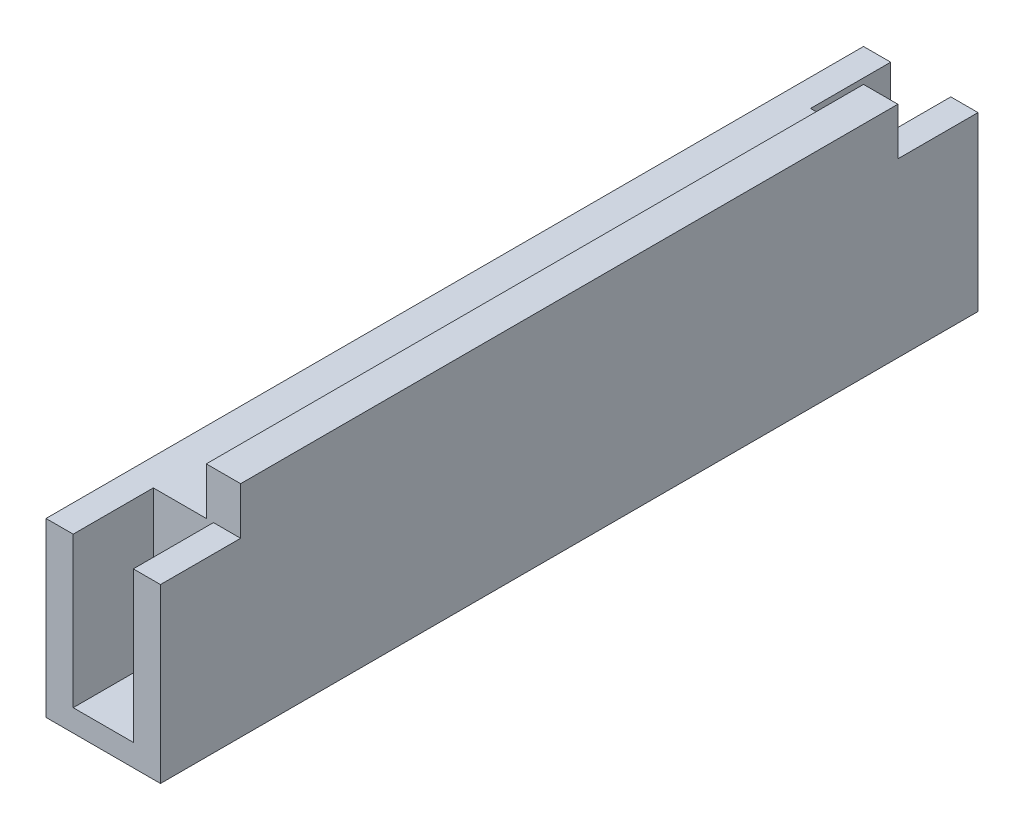
ISO-10303-21;
HEADER;
FILE_DESCRIPTION(('STEP AP214'),'2;1');
FILE_NAME('part.step','',(''),(''),'','','');
FILE_SCHEMA(('AUTOMOTIVE_DESIGN { 1 0 10303 214 1 1 1 1 }'));
ENDSEC;
DATA;
#1=APPLICATION_CONTEXT('core data for automotive mechanical design processes');
#2=APPLICATION_PROTOCOL_DEFINITION('international standard','automotive_design',2000,#1);
#3=PRODUCT_CONTEXT('',#1,'mechanical');
#4=PRODUCT('Part','Part','',(#3));
#5=PRODUCT_RELATED_PRODUCT_CATEGORY('part','',(#4));
#6=PRODUCT_DEFINITION_FORMATION('','',#4);
#7=PRODUCT_DEFINITION_CONTEXT('part definition',#1,'design');
#8=PRODUCT_DEFINITION('design','',#6,#7);
#9=PRODUCT_DEFINITION_SHAPE('','',#8);
#10=(LENGTH_UNIT() NAMED_UNIT(*) SI_UNIT(.MILLI.,.METRE.));
#11=(NAMED_UNIT(*) PLANE_ANGLE_UNIT() SI_UNIT($,.RADIAN.));
#12=(NAMED_UNIT(*) SI_UNIT($,.STERADIAN.) SOLID_ANGLE_UNIT());
#13=UNCERTAINTY_MEASURE_WITH_UNIT(LENGTH_MEASURE(1.E-05),#10,'distance_accuracy_value','');
#14=(GEOMETRIC_REPRESENTATION_CONTEXT(3) GLOBAL_UNCERTAINTY_ASSIGNED_CONTEXT((#13)) GLOBAL_UNIT_ASSIGNED_CONTEXT((#10,
#11,#12)) REPRESENTATION_CONTEXT('',''));
#15=CARTESIAN_POINT('',(0.,0.,0.));
#16=DIRECTION('',(0.,0.,1.));
#17=DIRECTION('',(1.,0.,0.));
#18=AXIS2_PLACEMENT_3D('',#15,#16,#17);
#19=CARTESIAN_POINT('',(-41.8906827095096,0.133383078751972,10.2));
#20=CARTESIAN_POINT('',(-41.8906827095096,4.95,10.2));
#21=CARTESIAN_POINT('',(-37.2024901953828,0.133383078751972,10.2));
#22=CARTESIAN_POINT('',(-37.2024901953828,4.95,10.2));
#23=(BOUNDED_SURFACE() B_SPLINE_SURFACE(1,1,((#19,#20),(#21,#22)),.UNSPECIFIED.,.F.,.F.,
.F.) B_SPLINE_SURFACE_WITH_KNOTS((2,2),(2,2),(0.,1.),(2.04421535087847,6.8608322721265),
.UNSPECIFIED.) GEOMETRIC_REPRESENTATION_ITEM() RATIONAL_B_SPLINE_SURFACE(((1.,1.),(1.,1.))) REPRESENTATION_ITEM('') SURFACE());
#24=CARTESIAN_POINT('',(-38.2715864524463,4.95,10.2));
#25=CARTESIAN_POINT('',(-38.2715864524463,1.2,10.2));
#26=(BOUNDED_CURVE() B_SPLINE_CURVE(1,(#24,#25),.UNSPECIFIED.,.F.,
.F.) B_SPLINE_CURVE_WITH_KNOTS((2,2),(0.,1.),
.UNSPECIFIED.) CURVE() GEOMETRIC_REPRESENTATION_ITEM() RATIONAL_B_SPLINE_CURVE((1.,1.)) REPRESENTATION_ITEM(''));
#27=CARTESIAN_POINT('',(-38.2715864524463,4.95,10.2));
#28=VERTEX_POINT('',#27);
#29=CARTESIAN_POINT('',(-38.2715864524463,1.2,10.2));
#30=VERTEX_POINT('',#29);
#31=EDGE_CURVE('E11',#28,#30,#26,.T.);
#32=CARTESIAN_POINT('',(-38.2715864524463,1.2,10.2));
#33=CARTESIAN_POINT('',(-39.7715864524463,1.2,10.2));
#34=(BOUNDED_CURVE() B_SPLINE_CURVE(1,(#32,#33),.UNSPECIFIED.,.F.,
.F.) B_SPLINE_CURVE_WITH_KNOTS((2,2),(0.,1.),
.UNSPECIFIED.) CURVE() GEOMETRIC_REPRESENTATION_ITEM() RATIONAL_B_SPLINE_CURVE((1.,1.)) REPRESENTATION_ITEM(''));
#35=CARTESIAN_POINT('',(-39.7715864524463,1.2,10.2));
#36=VERTEX_POINT('',#35);
#37=EDGE_CURVE('E32',#30,#36,#34,.T.);
#38=CARTESIAN_POINT('',(-39.7715864524463,1.2,10.2));
#39=CARTESIAN_POINT('',(-39.7715864524463,4.95,10.2));
#40=(BOUNDED_CURVE() B_SPLINE_CURVE(1,(#38,#39),.UNSPECIFIED.,.F.,
.F.) B_SPLINE_CURVE_WITH_KNOTS((2,2),(0.,1.),
.UNSPECIFIED.) CURVE() GEOMETRIC_REPRESENTATION_ITEM() RATIONAL_B_SPLINE_CURVE((1.,1.)) REPRESENTATION_ITEM(''));
#41=CARTESIAN_POINT('',(-39.7715864524463,4.95,10.2));
#42=VERTEX_POINT('',#41);
#43=EDGE_CURVE('E410',#36,#42,#40,.T.);
#44=CARTESIAN_POINT('',(-40.4499999999991,4.95,10.2));
#45=CARTESIAN_POINT('',(-39.7715864524463,4.95,10.2));
#46=(BOUNDED_CURVE() B_SPLINE_CURVE(1,(#44,#45),.UNSPECIFIED.,.F.,
.F.) B_SPLINE_CURVE_WITH_KNOTS((2,2),(0.307300245279898,0.452007090297156),
.UNSPECIFIED.) CURVE() GEOMETRIC_REPRESENTATION_ITEM() RATIONAL_B_SPLINE_CURVE((1.,1.)) REPRESENTATION_ITEM(''));
#47=CARTESIAN_POINT('',(-40.4499999999991,4.95,10.2));
#48=VERTEX_POINT('',#47);
#49=EDGE_CURVE('E155',#48,#42,#46,.T.);
#50=CARTESIAN_POINT('',(-40.4499999999991,0.650000000000009,10.2));
#51=CARTESIAN_POINT('',(-40.4499999999991,4.95,10.2));
#52=(BOUNDED_CURVE() B_SPLINE_CURVE(1,(#50,#51),.UNSPECIFIED.,.F.,
.F.) B_SPLINE_CURVE_WITH_KNOTS((2,2),(0.107257215945289,1.),
.UNSPECIFIED.) CURVE() GEOMETRIC_REPRESENTATION_ITEM() RATIONAL_B_SPLINE_CURVE((1.,1.)) REPRESENTATION_ITEM(''));
#53=CARTESIAN_POINT('',(-40.4499999999991,0.65,10.2));
#54=VERTEX_POINT('',#53);
#55=EDGE_CURVE('E408',#54,#48,#52,.T.);
#56=CARTESIAN_POINT('',(-40.4499999999991,0.650000000000009,10.2));
#57=CARTESIAN_POINT('',(-37.5931729048935,0.650000000000009,10.2));
#58=(BOUNDED_CURVE() B_SPLINE_CURVE(1,(#56,#57),.UNSPECIFIED.,.F.,
.F.) B_SPLINE_CURVE_WITH_KNOTS((2,2),(0.307300245279903,0.91666666666665),
.UNSPECIFIED.) CURVE() GEOMETRIC_REPRESENTATION_ITEM() RATIONAL_B_SPLINE_CURVE((1.,1.)) REPRESENTATION_ITEM(''));
#59=CARTESIAN_POINT('',(-37.5931729048935,0.65,10.2));
#60=VERTEX_POINT('',#59);
#61=EDGE_CURVE('E191',#54,#60,#58,.T.);
#62=CARTESIAN_POINT('',(-37.5931729048935,4.95,10.2));
#63=CARTESIAN_POINT('',(-37.5931729048935,0.650000000000009,10.2));
#64=(BOUNDED_CURVE() B_SPLINE_CURVE(1,(#62,#63),.UNSPECIFIED.,.F.,
.F.) B_SPLINE_CURVE_WITH_KNOTS((2,2),(0.,0.892742784054711),
.UNSPECIFIED.) CURVE() GEOMETRIC_REPRESENTATION_ITEM() RATIONAL_B_SPLINE_CURVE((1.,1.)) REPRESENTATION_ITEM(''));
#65=CARTESIAN_POINT('',(-37.5931729048935,4.95,10.2));
#66=VERTEX_POINT('',#65);
#67=EDGE_CURVE('E304',#66,#60,#64,.T.);
#68=CARTESIAN_POINT('',(-38.2715864524463,4.95,10.2));
#69=CARTESIAN_POINT('',(-37.5931729048935,4.95,10.2));
#70=(BOUNDED_CURVE() B_SPLINE_CURVE(1,(#68,#69),.UNSPECIFIED.,.F.,
.F.) B_SPLINE_CURVE_WITH_KNOTS((2,2),(0.771959821649399,0.916666666666644),
.UNSPECIFIED.) CURVE() GEOMETRIC_REPRESENTATION_ITEM() RATIONAL_B_SPLINE_CURVE((1.,1.)) REPRESENTATION_ITEM(''));
#71=EDGE_CURVE('E274',#28,#66,#70,.T.);
#72=ORIENTED_EDGE('',*,*,#31,.T.);
#73=ORIENTED_EDGE('',*,*,#37,.T.);
#74=ORIENTED_EDGE('',*,*,#43,.T.);
#75=ORIENTED_EDGE('',*,*,#49,.F.);
#76=ORIENTED_EDGE('',*,*,#55,.F.);
#77=ORIENTED_EDGE('',*,*,#61,.T.);
#78=ORIENTED_EDGE('',*,*,#67,.F.);
#79=ORIENTED_EDGE('',*,*,#71,.F.);
#80=EDGE_LOOP('',(#72,#73,#74,#75,#76,#77,#78,#79));
#81=FACE_BOUND('',#80,.T.);
#82=ADVANCED_FACE('F17',(#81),#23,.T.);
#83=CARTESIAN_POINT('',(-38.2715864524463,1.2,-12.24));
#84=CARTESIAN_POINT('',(-38.2715864524463,4.95,-12.24));
#85=CARTESIAN_POINT('',(-38.2715864524463,1.2,12.24));
#86=CARTESIAN_POINT('',(-38.2715864524463,4.95,12.24));
#87=(BOUNDED_SURFACE() B_SPLINE_SURFACE(1,1,((#83,#84),(#85,#86)),.UNSPECIFIED.,.F.,.F.,
.F.) B_SPLINE_SURFACE_WITH_KNOTS((2,2),(2,2),(0.,1.),(1.5,9.),
.UNSPECIFIED.) GEOMETRIC_REPRESENTATION_ITEM() RATIONAL_B_SPLINE_SURFACE(((1.,1.),(1.,1.))) REPRESENTATION_ITEM('') SURFACE());
#88=CARTESIAN_POINT('',(-38.2715864524463,4.95,8.2));
#89=CARTESIAN_POINT('',(-38.2715864524463,4.95,10.2));
#90=(BOUNDED_CURVE() B_SPLINE_CURVE(1,(#88,#89),.UNSPECIFIED.,.F.,
.F.) B_SPLINE_CURVE_WITH_KNOTS((2,2),(0.834967320261438,0.916666666666667),
.UNSPECIFIED.) CURVE() GEOMETRIC_REPRESENTATION_ITEM() RATIONAL_B_SPLINE_CURVE((1.,1.)) REPRESENTATION_ITEM(''));
#91=CARTESIAN_POINT('',(-38.2715864524463,4.95,8.2));
#92=VERTEX_POINT('',#91);
#93=EDGE_CURVE('E275',#92,#28,#90,.T.);
#94=CARTESIAN_POINT('',(-38.2715864524463,4.95,8.2));
#95=CARTESIAN_POINT('',(-38.2715864524463,1.2,8.2));
#96=(BOUNDED_CURVE() B_SPLINE_CURVE(1,(#94,#95),.UNSPECIFIED.,.F.,
.F.) B_SPLINE_CURVE_WITH_KNOTS((2,2),(0.,1.),
.UNSPECIFIED.) CURVE() GEOMETRIC_REPRESENTATION_ITEM() RATIONAL_B_SPLINE_CURVE((1.,1.)) REPRESENTATION_ITEM(''));
#97=CARTESIAN_POINT('',(-38.2715864524463,1.2,8.2));
#98=VERTEX_POINT('',#97);
#99=EDGE_CURVE('E182',#92,#98,#96,.T.);
#100=CARTESIAN_POINT('',(-38.2715864524463,1.2,8.2));
#101=CARTESIAN_POINT('',(-38.2715864524463,1.2,10.2));
#102=(BOUNDED_CURVE() B_SPLINE_CURVE(1,(#100,#101),.UNSPECIFIED.,.F.,
.F.) B_SPLINE_CURVE_WITH_KNOTS((2,2),(0.834967320261438,0.916666666666666),
.UNSPECIFIED.) CURVE() GEOMETRIC_REPRESENTATION_ITEM() RATIONAL_B_SPLINE_CURVE((1.,1.)) REPRESENTATION_ITEM(''));
#103=EDGE_CURVE('E23',#98,#30,#102,.T.);
#104=ORIENTED_EDGE('',*,*,#93,.F.);
#105=ORIENTED_EDGE('',*,*,#99,.T.);
#106=ORIENTED_EDGE('',*,*,#103,.T.);
#107=ORIENTED_EDGE('',*,*,#31,.F.);
#108=EDGE_LOOP('',(#104,#105,#106,#107));
#109=FACE_BOUND('',#108,.T.);
#110=ADVANCED_FACE('F337',(#109),#87,.T.);
#111=CARTESIAN_POINT('',(-39.9405579560875,1.10328917316983,8.2));
#112=CARTESIAN_POINT('',(-39.9405579560875,6.248,8.2));
#113=CARTESIAN_POINT('',(-36.4915728521906,1.10328917316983,8.2));
#114=CARTESIAN_POINT('',(-36.4915728521906,6.248,8.2));
#115=(BOUNDED_SURFACE() B_SPLINE_SURFACE(1,1,((#111,#112),(#113,#114)),.UNSPECIFIED.,.F.,.F.,
.F.) B_SPLINE_SURFACE_WITH_KNOTS((2,2),(2,2),(-1.49055795608844,1.95842714780846),
(-2.63327035793089,1.),
.UNSPECIFIED.) GEOMETRIC_REPRESENTATION_ITEM() RATIONAL_B_SPLINE_SURFACE(((1.,1.),(1.,1.))) REPRESENTATION_ITEM('') SURFACE());
#116=CARTESIAN_POINT('',(-38.2715864524463,4.95,8.2));
#117=CARTESIAN_POINT('',(-37.5931729048935,4.95,8.2));
#118=(BOUNDED_CURVE() B_SPLINE_CURVE(1,(#116,#117),.UNSPECIFIED.,.F.,
.F.) B_SPLINE_CURVE_WITH_KNOTS((2,2),(0.208225846932172,1.),
.UNSPECIFIED.) CURVE() GEOMETRIC_REPRESENTATION_ITEM() RATIONAL_B_SPLINE_CURVE((1.,1.)) REPRESENTATION_ITEM(''));
#119=CARTESIAN_POINT('',(-37.5931729048935,4.95,8.2));
#120=VERTEX_POINT('',#119);
#121=EDGE_CURVE('E220',#92,#120,#118,.T.);
#122=CARTESIAN_POINT('',(-37.5931729048935,4.95,8.2));
#123=CARTESIAN_POINT('',(-37.5931729048935,6.13,8.2));
#124=(BOUNDED_CURVE() B_SPLINE_CURVE(1,(#122,#123),.UNSPECIFIED.,.F.,
.F.) B_SPLINE_CURVE_WITH_KNOTS((2,2),(0.0833333333333368,0.916666666666665),
.UNSPECIFIED.) CURVE() GEOMETRIC_REPRESENTATION_ITEM() RATIONAL_B_SPLINE_CURVE((1.,1.)) REPRESENTATION_ITEM(''));
#125=CARTESIAN_POINT('',(-37.5931729048935,6.13,8.2));
#126=VERTEX_POINT('',#125);
#127=EDGE_CURVE('E212',#120,#126,#124,.T.);
#128=CARTESIAN_POINT('',(-37.5931729048935,6.13,8.2));
#129=CARTESIAN_POINT('',(-38.4499999999991,6.13,8.2));
#130=(BOUNDED_CURVE() B_SPLINE_CURVE(1,(#128,#129),.UNSPECIFIED.,.F.,
.F.) B_SPLINE_CURVE_WITH_KNOTS((2,2),(0.562492229509584,1.),
.UNSPECIFIED.) CURVE() GEOMETRIC_REPRESENTATION_ITEM() RATIONAL_B_SPLINE_CURVE((1.,1.)) REPRESENTATION_ITEM(''));
#131=CARTESIAN_POINT('',(-38.4499999999991,6.13,8.2));
#132=VERTEX_POINT('',#131);
#133=EDGE_CURVE('E221',#126,#132,#130,.T.);
#134=CARTESIAN_POINT('',(-38.4499999999991,4.95,8.2));
#135=CARTESIAN_POINT('',(-38.4499999999991,6.13,8.2));
#136=(BOUNDED_CURVE() B_SPLINE_CURVE(1,(#134,#135),.UNSPECIFIED.,.F.,
.F.) B_SPLINE_CURVE_WITH_KNOTS((2,2),(0.0833333333333368,0.916666666666663),
.UNSPECIFIED.) CURVE() GEOMETRIC_REPRESENTATION_ITEM() RATIONAL_B_SPLINE_CURVE((1.,1.)) REPRESENTATION_ITEM(''));
#137=CARTESIAN_POINT('',(-38.4499999999991,4.95,8.2));
#138=VERTEX_POINT('',#137);
#139=EDGE_CURVE('E251',#138,#132,#136,.T.);
#140=CARTESIAN_POINT('',(-38.4499999999991,4.95,8.2));
#141=CARTESIAN_POINT('',(-39.7715864524463,4.95,8.2));
#142=(BOUNDED_CURVE() B_SPLINE_CURVE(1,(#140,#141),.UNSPECIFIED.,.F.,
.F.) B_SPLINE_CURVE_WITH_KNOTS((2,2),(0.,1.),
.UNSPECIFIED.) CURVE() GEOMETRIC_REPRESENTATION_ITEM() RATIONAL_B_SPLINE_CURVE((1.,1.)) REPRESENTATION_ITEM(''));
#143=CARTESIAN_POINT('',(-39.7715864524463,4.95,8.2));
#144=VERTEX_POINT('',#143);
#145=EDGE_CURVE('E490',#138,#144,#142,.T.);
#146=CARTESIAN_POINT('',(-39.7715864524463,1.2,8.2));
#147=CARTESIAN_POINT('',(-39.7715864524463,4.95,8.2));
#148=(BOUNDED_CURVE() B_SPLINE_CURVE(1,(#146,#147),.UNSPECIFIED.,.F.,
.F.) B_SPLINE_CURVE_WITH_KNOTS((2,2),(0.,1.),
.UNSPECIFIED.) CURVE() GEOMETRIC_REPRESENTATION_ITEM() RATIONAL_B_SPLINE_CURVE((1.,1.)) REPRESENTATION_ITEM(''));
#149=CARTESIAN_POINT('',(-39.7715864524463,1.2,8.2));
#150=VERTEX_POINT('',#149);
#151=EDGE_CURVE('E241',#150,#144,#148,.T.);
#152=CARTESIAN_POINT('',(-38.2715864524463,1.2,8.2));
#153=CARTESIAN_POINT('',(-39.7715864524463,1.2,8.2));
#154=(BOUNDED_CURVE() B_SPLINE_CURVE(1,(#152,#153),.UNSPECIFIED.,.F.,
.F.) B_SPLINE_CURVE_WITH_KNOTS((2,2),(0.,1.),
.UNSPECIFIED.) CURVE() GEOMETRIC_REPRESENTATION_ITEM() RATIONAL_B_SPLINE_CURVE((1.,1.)) REPRESENTATION_ITEM(''));
#155=EDGE_CURVE('E222',#98,#150,#154,.T.);
#156=ORIENTED_EDGE('',*,*,#121,.T.);
#157=ORIENTED_EDGE('',*,*,#127,.T.);
#158=ORIENTED_EDGE('',*,*,#133,.T.);
#159=ORIENTED_EDGE('',*,*,#139,.F.);
#160=ORIENTED_EDGE('',*,*,#145,.T.);
#161=ORIENTED_EDGE('',*,*,#151,.F.);
#162=ORIENTED_EDGE('',*,*,#155,.F.);
#163=ORIENTED_EDGE('',*,*,#99,.F.);
#164=EDGE_LOOP('',(#156,#157,#158,#159,#160,#161,#162,#163));
#165=FACE_BOUND('',#164,.T.);
#166=ADVANCED_FACE('F643',(#165),#115,.T.);
#167=CARTESIAN_POINT('',(-38.4499999999991,4.832,-8.2));
#168=CARTESIAN_POINT('',(-38.4499999999991,6.248,-8.2));
#169=CARTESIAN_POINT('',(-38.4499999999991,4.832,8.2));
#170=CARTESIAN_POINT('',(-38.4499999999991,6.248,8.2));
#171=(BOUNDED_SURFACE() B_SPLINE_SURFACE(1,1,((#167,#168),(#169,#170)),.UNSPECIFIED.,.F.,.F.,
.F.) B_SPLINE_SURFACE_WITH_KNOTS((2,2),(2,2),(20.3168542956169,36.7168542956169),(0.,1.),
.UNSPECIFIED.) GEOMETRIC_REPRESENTATION_ITEM() RATIONAL_B_SPLINE_SURFACE(((1.,1.),(1.,1.))) REPRESENTATION_ITEM('') SURFACE());
#172=CARTESIAN_POINT('',(-38.4499999999991,4.95,-8.2));
#173=CARTESIAN_POINT('',(-38.4499999999991,6.13,-8.2));
#174=(BOUNDED_CURVE() B_SPLINE_CURVE(1,(#172,#173),.UNSPECIFIED.,.F.,
.F.) B_SPLINE_CURVE_WITH_KNOTS((2,2),(0.0833333333333368,0.916666666666663),
.UNSPECIFIED.) CURVE() GEOMETRIC_REPRESENTATION_ITEM() RATIONAL_B_SPLINE_CURVE((1.,1.)) REPRESENTATION_ITEM(''));
#175=CARTESIAN_POINT('',(-38.4499999999991,4.95,-8.2));
#176=VERTEX_POINT('',#175);
#177=CARTESIAN_POINT('',(-38.4499999999991,6.13,-8.2));
#178=VERTEX_POINT('',#177);
#179=EDGE_CURVE('E284',#176,#178,#174,.T.);
#180=CARTESIAN_POINT('',(-38.4499999999991,4.95,-8.2));
#181=CARTESIAN_POINT('',(-38.4499999999991,4.95,8.2));
#182=(BOUNDED_CURVE() B_SPLINE_CURVE(1,(#180,#181),.UNSPECIFIED.,.F.,
.F.) B_SPLINE_CURVE_WITH_KNOTS((2,2),(0.,1.),
.UNSPECIFIED.) CURVE() GEOMETRIC_REPRESENTATION_ITEM() RATIONAL_B_SPLINE_CURVE((1.,1.)) REPRESENTATION_ITEM(''));
#183=EDGE_CURVE('E481',#176,#138,#182,.T.);
#184=CARTESIAN_POINT('',(-38.4499999999991,6.13,-8.2));
#185=CARTESIAN_POINT('',(-38.4499999999991,6.13,8.2));
#186=(BOUNDED_CURVE() B_SPLINE_CURVE(1,(#184,#185),.UNSPECIFIED.,.F.,
.F.) B_SPLINE_CURVE_WITH_KNOTS((2,2),(0.25,0.75),
.UNSPECIFIED.) CURVE() GEOMETRIC_REPRESENTATION_ITEM() RATIONAL_B_SPLINE_CURVE((1.,1.)) REPRESENTATION_ITEM(''));
#187=EDGE_CURVE('E192',#178,#132,#186,.T.);
#188=ORIENTED_EDGE('',*,*,#179,.F.);
#189=ORIENTED_EDGE('',*,*,#183,.T.);
#190=ORIENTED_EDGE('',*,*,#139,.T.);
#191=ORIENTED_EDGE('',*,*,#187,.F.);
#192=EDGE_LOOP('',(#188,#189,#190,#191));
#193=FACE_BOUND('',#192,.T.);
#194=ADVANCED_FACE('F648',(#193),#171,.T.);
#195=CARTESIAN_POINT('',(-37.5184392823658,1.10328917316983,-8.2));
#196=CARTESIAN_POINT('',(-37.5184392823658,6.23582280949913,-8.2));
#197=CARTESIAN_POINT('',(-39.9405579560875,1.10328917316983,-8.2));
#198=CARTESIAN_POINT('',(-39.9405579560875,6.23582280949913,-8.2));
#199=(BOUNDED_SURFACE() B_SPLINE_SURFACE(1,1,((#195,#196),(#197,#198)),.UNSPECIFIED.,.F.,.F.,
.F.) B_SPLINE_SURFACE_WITH_KNOTS((2,2),(2,2),(-1.44520642011319,1.),(0.0618420384821837,
1.20240506877758),.UNSPECIFIED.) GEOMETRIC_REPRESENTATION_ITEM() RATIONAL_B_SPLINE_SURFACE(((1.,
1.),(1.,1.))) REPRESENTATION_ITEM('') SURFACE());
#200=CARTESIAN_POINT('',(-39.7715864524463,1.2,-8.2));
#201=CARTESIAN_POINT('',(-39.7715864524463,4.95,-8.2));
#202=(BOUNDED_CURVE() B_SPLINE_CURVE(1,(#200,#201),.UNSPECIFIED.,.F.,
.F.) B_SPLINE_CURVE_WITH_KNOTS((2,2),(0.,1.),
.UNSPECIFIED.) CURVE() GEOMETRIC_REPRESENTATION_ITEM() RATIONAL_B_SPLINE_CURVE((1.,1.)) REPRESENTATION_ITEM(''));
#203=CARTESIAN_POINT('',(-39.7715864524463,1.2,-8.2));
#204=VERTEX_POINT('',#203);
#205=CARTESIAN_POINT('',(-39.7715864524463,4.95,-8.2));
#206=VERTEX_POINT('',#205);
#207=EDGE_CURVE('E293',#204,#206,#202,.T.);
#208=CARTESIAN_POINT('',(-38.4499999999991,4.95,-8.2));
#209=CARTESIAN_POINT('',(-39.7715864524463,4.95,-8.2));
#210=(BOUNDED_CURVE() B_SPLINE_CURVE(1,(#208,#209),.UNSPECIFIED.,.F.,
.F.) B_SPLINE_CURVE_WITH_KNOTS((2,2),(0.,1.),
.UNSPECIFIED.) CURVE() GEOMETRIC_REPRESENTATION_ITEM() RATIONAL_B_SPLINE_CURVE((1.,1.)) REPRESENTATION_ITEM(''));
#211=EDGE_CURVE('E135',#176,#206,#210,.T.);
#212=CARTESIAN_POINT('',(-38.4499999999991,6.13,-8.2));
#213=CARTESIAN_POINT('',(-37.5931729048935,6.13,-8.2));
#214=(BOUNDED_CURVE() B_SPLINE_CURVE(1,(#212,#213),.UNSPECIFIED.,.F.,
.F.) B_SPLINE_CURVE_WITH_KNOTS((2,2),(0.,0.437507770490416),
.UNSPECIFIED.) CURVE() GEOMETRIC_REPRESENTATION_ITEM() RATIONAL_B_SPLINE_CURVE((1.,1.)) REPRESENTATION_ITEM(''));
#215=CARTESIAN_POINT('',(-37.5931729048935,6.13,-8.2));
#216=VERTEX_POINT('',#215);
#217=EDGE_CURVE('E294',#178,#216,#214,.T.);
#218=CARTESIAN_POINT('',(-37.5931729048935,6.13,-8.2));
#219=CARTESIAN_POINT('',(-37.5931729048935,4.95,-8.2));
#220=(BOUNDED_CURVE() B_SPLINE_CURVE(1,(#218,#219),.UNSPECIFIED.,.F.,
.F.) B_SPLINE_CURVE_WITH_KNOTS((2,2),(0.0833333333333349,0.916666666666663),
.UNSPECIFIED.) CURVE() GEOMETRIC_REPRESENTATION_ITEM() RATIONAL_B_SPLINE_CURVE((1.,1.)) REPRESENTATION_ITEM(''));
#221=CARTESIAN_POINT('',(-37.5931729048935,4.95,-8.2));
#222=VERTEX_POINT('',#221);
#223=EDGE_CURVE('E295',#216,#222,#220,.T.);
#224=CARTESIAN_POINT('',(-37.5931729048935,4.95,-8.2));
#225=CARTESIAN_POINT('',(-38.2715864524463,4.95,-8.2));
#226=(BOUNDED_CURVE() B_SPLINE_CURVE(1,(#224,#225),.UNSPECIFIED.,.F.,
.F.) B_SPLINE_CURVE_WITH_KNOTS((2,2),(0.,0.791774153067828),
.UNSPECIFIED.) CURVE() GEOMETRIC_REPRESENTATION_ITEM() RATIONAL_B_SPLINE_CURVE((1.,1.)) REPRESENTATION_ITEM(''));
#227=CARTESIAN_POINT('',(-38.2715864524463,4.95,-8.2));
#228=VERTEX_POINT('',#227);
#229=EDGE_CURVE('E138',#222,#228,#226,.T.);
#230=CARTESIAN_POINT('',(-38.2715864524463,1.2,-8.2));
#231=CARTESIAN_POINT('',(-38.2715864524463,4.95,-8.2));
#232=(BOUNDED_CURVE() B_SPLINE_CURVE(1,(#230,#231),.UNSPECIFIED.,.F.,
.F.) B_SPLINE_CURVE_WITH_KNOTS((2,2),(0.,1.),
.UNSPECIFIED.) CURVE() GEOMETRIC_REPRESENTATION_ITEM() RATIONAL_B_SPLINE_CURVE((1.,1.)) REPRESENTATION_ITEM(''));
#233=CARTESIAN_POINT('',(-38.2715864524463,1.2,-8.2));
#234=VERTEX_POINT('',#233);
#235=EDGE_CURVE('E434',#234,#228,#232,.T.);
#236=CARTESIAN_POINT('',(-39.7715864524463,1.2,-8.2));
#237=CARTESIAN_POINT('',(-38.2715864524463,1.2,-8.2));
#238=(BOUNDED_CURVE() B_SPLINE_CURVE(1,(#236,#237),.UNSPECIFIED.,.F.,
.F.) B_SPLINE_CURVE_WITH_KNOTS((2,2),(0.,1.),
.UNSPECIFIED.) CURVE() GEOMETRIC_REPRESENTATION_ITEM() RATIONAL_B_SPLINE_CURVE((1.,1.)) REPRESENTATION_ITEM(''));
#239=EDGE_CURVE('E172',#204,#234,#238,.T.);
#240=ORIENTED_EDGE('',*,*,#207,.T.);
#241=ORIENTED_EDGE('',*,*,#211,.F.);
#242=ORIENTED_EDGE('',*,*,#179,.T.);
#243=ORIENTED_EDGE('',*,*,#217,.T.);
#244=ORIENTED_EDGE('',*,*,#223,.T.);
#245=ORIENTED_EDGE('',*,*,#229,.T.);
#246=ORIENTED_EDGE('',*,*,#235,.F.);
#247=ORIENTED_EDGE('',*,*,#239,.F.);
#248=EDGE_LOOP('',(#240,#241,#242,#243,#244,#245,#246,#247));
#249=FACE_BOUND('',#248,.T.);
#250=ADVANCED_FACE('F628',(#249),#199,.T.);
#251=CARTESIAN_POINT('',(-39.7715864524463,4.95,-12.24));
#252=CARTESIAN_POINT('',(-39.7715864524463,1.2,-12.24));
#253=CARTESIAN_POINT('',(-39.7715864524463,4.95,12.24));
#254=CARTESIAN_POINT('',(-39.7715864524463,1.2,12.24));
#255=(BOUNDED_SURFACE() B_SPLINE_SURFACE(1,1,((#251,#252),(#253,#254)),.UNSPECIFIED.,.F.,.F.,
.F.) B_SPLINE_SURFACE_WITH_KNOTS((2,2),(2,2),(0.,1.),(10.5,18.),
.UNSPECIFIED.) GEOMETRIC_REPRESENTATION_ITEM() RATIONAL_B_SPLINE_SURFACE(((1.,1.),(1.,1.))) REPRESENTATION_ITEM('') SURFACE());
#256=CARTESIAN_POINT('',(-39.7715864524463,4.95,-10.2));
#257=CARTESIAN_POINT('',(-39.7715864524463,4.95,-8.2));
#258=(BOUNDED_CURVE() B_SPLINE_CURVE(1,(#256,#257),.UNSPECIFIED.,.F.,
.F.) B_SPLINE_CURVE_WITH_KNOTS((2,2),(0.0833333333333337,0.165032679738562),
.UNSPECIFIED.) CURVE() GEOMETRIC_REPRESENTATION_ITEM() RATIONAL_B_SPLINE_CURVE((1.,1.)) REPRESENTATION_ITEM(''));
#259=CARTESIAN_POINT('',(-39.7715864524463,4.95,-10.2));
#260=VERTEX_POINT('',#259);
#261=EDGE_CURVE('E115',#260,#206,#258,.T.);
#262=CARTESIAN_POINT('',(-39.7715864524463,1.2,-10.2));
#263=CARTESIAN_POINT('',(-39.7715864524463,1.2,-8.2));
#264=(BOUNDED_CURVE() B_SPLINE_CURVE(1,(#262,#263),.UNSPECIFIED.,.F.,
.F.) B_SPLINE_CURVE_WITH_KNOTS((2,2),(0.0833333333333338,0.165032679738562),
.UNSPECIFIED.) CURVE() GEOMETRIC_REPRESENTATION_ITEM() RATIONAL_B_SPLINE_CURVE((1.,1.)) REPRESENTATION_ITEM(''));
#265=CARTESIAN_POINT('',(-39.7715864524463,1.2,-10.2));
#266=VERTEX_POINT('',#265);
#267=EDGE_CURVE('E117',#266,#204,#264,.T.);
#268=CARTESIAN_POINT('',(-39.7715864524463,4.95,-10.2));
#269=CARTESIAN_POINT('',(-39.7715864524463,1.2,-10.2));
#270=(BOUNDED_CURVE() B_SPLINE_CURVE(1,(#268,#269),.UNSPECIFIED.,.F.,
.F.) B_SPLINE_CURVE_WITH_KNOTS((2,2),(0.,1.),
.UNSPECIFIED.) CURVE() GEOMETRIC_REPRESENTATION_ITEM() RATIONAL_B_SPLINE_CURVE((1.,1.)) REPRESENTATION_ITEM(''));
#271=EDGE_CURVE('E112',#260,#266,#270,.T.);
#272=ORIENTED_EDGE('',*,*,#261,.T.);
#273=ORIENTED_EDGE('',*,*,#207,.F.);
#274=ORIENTED_EDGE('',*,*,#267,.F.);
#275=ORIENTED_EDGE('',*,*,#271,.F.);
#276=EDGE_LOOP('',(#272,#273,#274,#275));
#277=FACE_BOUND('',#276,.T.);
#278=ADVANCED_FACE('F19',(#277),#255,.T.);
#279=CARTESIAN_POINT('',(-37.2024901953828,0.133383078751972,-10.2));
#280=CARTESIAN_POINT('',(-37.2024901953828,4.95,-10.2));
#281=CARTESIAN_POINT('',(-41.8906827095096,0.133383078751972,-10.2));
#282=CARTESIAN_POINT('',(-41.8906827095096,4.95,-10.2));
#283=(BOUNDED_SURFACE() B_SPLINE_SURFACE(1,1,((#279,#280),(#281,#282)),.UNSPECIFIED.,.F.,.F.,
.F.) B_SPLINE_SURFACE_WITH_KNOTS((2,2),(2,2),(0.,1.),(2.04421535087847,6.8608322721265),
.UNSPECIFIED.) GEOMETRIC_REPRESENTATION_ITEM() RATIONAL_B_SPLINE_SURFACE(((1.,1.),(1.,1.))) REPRESENTATION_ITEM('') SURFACE());
#284=CARTESIAN_POINT('',(-39.7715864524463,1.2,-10.2));
#285=CARTESIAN_POINT('',(-38.2715864524463,1.2,-10.2));
#286=(BOUNDED_CURVE() B_SPLINE_CURVE(1,(#284,#285),.UNSPECIFIED.,.F.,
.F.) B_SPLINE_CURVE_WITH_KNOTS((2,2),(0.,1.),
.UNSPECIFIED.) CURVE() GEOMETRIC_REPRESENTATION_ITEM() RATIONAL_B_SPLINE_CURVE((1.,1.)) REPRESENTATION_ITEM(''));
#287=CARTESIAN_POINT('',(-38.2715864524463,1.2,-10.2));
#288=VERTEX_POINT('',#287);
#289=EDGE_CURVE('E123',#266,#288,#286,.T.);
#290=CARTESIAN_POINT('',(-38.2715864524463,1.2,-10.2));
#291=CARTESIAN_POINT('',(-38.2715864524463,4.95,-10.2));
#292=(BOUNDED_CURVE() B_SPLINE_CURVE(1,(#290,#291),.UNSPECIFIED.,.F.,
.F.) B_SPLINE_CURVE_WITH_KNOTS((2,2),(0.,1.),
.UNSPECIFIED.) CURVE() GEOMETRIC_REPRESENTATION_ITEM() RATIONAL_B_SPLINE_CURVE((1.,1.)) REPRESENTATION_ITEM(''));
#293=CARTESIAN_POINT('',(-38.2715864524463,4.95,-10.2));
#294=VERTEX_POINT('',#293);
#295=EDGE_CURVE('E255',#288,#294,#292,.T.);
#296=CARTESIAN_POINT('',(-37.5931729048935,4.95,-10.2));
#297=CARTESIAN_POINT('',(-38.2715864524463,4.95,-10.2));
#298=(BOUNDED_CURVE() B_SPLINE_CURVE(1,(#296,#297),.UNSPECIFIED.,.F.,
.F.) B_SPLINE_CURVE_WITH_KNOTS((2,2),(0.083333333333351,0.228040178350601),
.UNSPECIFIED.) CURVE() GEOMETRIC_REPRESENTATION_ITEM() RATIONAL_B_SPLINE_CURVE((1.,1.)) REPRESENTATION_ITEM(''));
#299=CARTESIAN_POINT('',(-37.5931729048935,4.95,-10.2));
#300=VERTEX_POINT('',#299);
#301=EDGE_CURVE('E203',#300,#294,#298,.T.);
#302=CARTESIAN_POINT('',(-37.5931729048935,0.650000000000009,-10.2));
#303=CARTESIAN_POINT('',(-37.5931729048935,4.95,-10.2));
#304=(BOUNDED_CURVE() B_SPLINE_CURVE(1,(#302,#303),.UNSPECIFIED.,.F.,
.F.) B_SPLINE_CURVE_WITH_KNOTS((2,2),(0.10725721594529,1.),
.UNSPECIFIED.) CURVE() GEOMETRIC_REPRESENTATION_ITEM() RATIONAL_B_SPLINE_CURVE((1.,1.)) REPRESENTATION_ITEM(''));
#305=CARTESIAN_POINT('',(-37.5931729048935,0.650000000000009,-10.2));
#306=VERTEX_POINT('',#305);
#307=EDGE_CURVE('E312',#306,#300,#304,.T.);
#308=CARTESIAN_POINT('',(-37.5931729048935,0.650000000000009,-10.2));
#309=CARTESIAN_POINT('',(-40.4499999999991,0.650000000000009,-10.2));
#310=(BOUNDED_CURVE() B_SPLINE_CURVE(1,(#308,#309),.UNSPECIFIED.,.F.,
.F.) B_SPLINE_CURVE_WITH_KNOTS((2,2),(0.083333333333348,0.692699754720096),
.UNSPECIFIED.) CURVE() GEOMETRIC_REPRESENTATION_ITEM() RATIONAL_B_SPLINE_CURVE((1.,1.)) REPRESENTATION_ITEM(''));
#311=CARTESIAN_POINT('',(-40.4499999999991,0.650000000000009,-10.2));
#312=VERTEX_POINT('',#311);
#313=EDGE_CURVE('E264',#306,#312,#310,.T.);
#314=CARTESIAN_POINT('',(-40.4499999999991,4.95,-10.2));
#315=CARTESIAN_POINT('',(-40.4499999999991,0.650000000000009,-10.2));
#316=(BOUNDED_CURVE() B_SPLINE_CURVE(1,(#314,#315),.UNSPECIFIED.,.F.,
.F.) B_SPLINE_CURVE_WITH_KNOTS((2,2),(0.,0.892742784054711),
.UNSPECIFIED.) CURVE() GEOMETRIC_REPRESENTATION_ITEM() RATIONAL_B_SPLINE_CURVE((1.,1.)) REPRESENTATION_ITEM(''));
#317=CARTESIAN_POINT('',(-40.4499999999991,4.95,-10.2));
#318=VERTEX_POINT('',#317);
#319=EDGE_CURVE('E143',#318,#312,#316,.T.);
#320=CARTESIAN_POINT('',(-39.7715864524463,4.95,-10.2));
#321=CARTESIAN_POINT('',(-40.4499999999991,4.95,-10.2));
#322=(BOUNDED_CURVE() B_SPLINE_CURVE(1,(#320,#321),.UNSPECIFIED.,.F.,
.F.) B_SPLINE_CURVE_WITH_KNOTS((2,2),(0.547992909702843,0.692699754720102),
.UNSPECIFIED.) CURVE() GEOMETRIC_REPRESENTATION_ITEM() RATIONAL_B_SPLINE_CURVE((1.,1.)) REPRESENTATION_ITEM(''));
#323=EDGE_CURVE('E132',#260,#318,#322,.T.);
#324=ORIENTED_EDGE('',*,*,#271,.T.);
#325=ORIENTED_EDGE('',*,*,#289,.T.);
#326=ORIENTED_EDGE('',*,*,#295,.T.);
#327=ORIENTED_EDGE('',*,*,#301,.F.);
#328=ORIENTED_EDGE('',*,*,#307,.F.);
#329=ORIENTED_EDGE('',*,*,#313,.T.);
#330=ORIENTED_EDGE('',*,*,#319,.F.);
#331=ORIENTED_EDGE('',*,*,#323,.F.);
#332=EDGE_LOOP('',(#324,#325,#326,#327,#328,#329,#330,#331));
#333=FACE_BOUND('',#332,.T.);
#334=ADVANCED_FACE('F140',(#333),#283,.T.);
#335=CARTESIAN_POINT('',(-39.7715864524463,1.2,-12.24));
#336=CARTESIAN_POINT('',(-38.2715864524463,1.2,-12.24));
#337=CARTESIAN_POINT('',(-39.7715864524463,1.2,12.24));
#338=CARTESIAN_POINT('',(-38.2715864524463,1.2,12.24));
#339=(BOUNDED_SURFACE() B_SPLINE_SURFACE(1,1,((#335,#336),(#337,#338)),.UNSPECIFIED.,.F.,.F.,
.F.) B_SPLINE_SURFACE_WITH_KNOTS((2,2),(2,2),(0.,1.),(0.,1.5),
.UNSPECIFIED.) GEOMETRIC_REPRESENTATION_ITEM() RATIONAL_B_SPLINE_SURFACE(((1.,1.),(1.,1.))) REPRESENTATION_ITEM('') SURFACE());
#340=CARTESIAN_POINT('',(-38.2715864524463,1.2,-10.2));
#341=CARTESIAN_POINT('',(-38.2715864524463,1.2,-8.2));
#342=(BOUNDED_CURVE() B_SPLINE_CURVE(1,(#340,#341),.UNSPECIFIED.,.F.,
.F.) B_SPLINE_CURVE_WITH_KNOTS((2,2),(0.083333333333334,0.165032679738562),
.UNSPECIFIED.) CURVE() GEOMETRIC_REPRESENTATION_ITEM() RATIONAL_B_SPLINE_CURVE((1.,1.)) REPRESENTATION_ITEM(''));
#343=EDGE_CURVE('E181',#288,#234,#342,.T.);
#344=ORIENTED_EDGE('',*,*,#267,.T.);
#345=ORIENTED_EDGE('',*,*,#239,.T.);
#346=ORIENTED_EDGE('',*,*,#343,.F.);
#347=ORIENTED_EDGE('',*,*,#289,.F.);
#348=EDGE_LOOP('',(#344,#345,#346,#347));
#349=FACE_BOUND('',#348,.T.);
#350=ADVANCED_FACE('F623',(#349),#339,.T.);
#351=CARTESIAN_POINT('',(-38.2715864524463,1.2,-12.24));
#352=CARTESIAN_POINT('',(-38.2715864524463,4.95,-12.24));
#353=CARTESIAN_POINT('',(-38.2715864524463,1.2,12.24));
#354=CARTESIAN_POINT('',(-38.2715864524463,4.95,12.24));
#355=(BOUNDED_SURFACE() B_SPLINE_SURFACE(1,1,((#351,#352),(#353,#354)),.UNSPECIFIED.,.F.,.F.,
.F.) B_SPLINE_SURFACE_WITH_KNOTS((2,2),(2,2),(0.,1.),(1.5,9.),
.UNSPECIFIED.) GEOMETRIC_REPRESENTATION_ITEM() RATIONAL_B_SPLINE_SURFACE(((1.,1.),(1.,1.))) REPRESENTATION_ITEM('') SURFACE());
#356=CARTESIAN_POINT('',(-38.2715864524463,4.95,-10.2));
#357=CARTESIAN_POINT('',(-38.2715864524463,4.95,-8.2));
#358=(BOUNDED_CURVE() B_SPLINE_CURVE(1,(#356,#357),.UNSPECIFIED.,.F.,
.F.) B_SPLINE_CURVE_WITH_KNOTS((2,2),(0.083333333333334,0.165032679738562),
.UNSPECIFIED.) CURVE() GEOMETRIC_REPRESENTATION_ITEM() RATIONAL_B_SPLINE_CURVE((1.,1.)) REPRESENTATION_ITEM(''));
#359=EDGE_CURVE('E201',#294,#228,#358,.T.);
#360=ORIENTED_EDGE('',*,*,#343,.T.);
#361=ORIENTED_EDGE('',*,*,#235,.T.);
#362=ORIENTED_EDGE('',*,*,#359,.F.);
#363=ORIENTED_EDGE('',*,*,#295,.F.);
#364=EDGE_LOOP('',(#360,#361,#362,#363));
#365=FACE_BOUND('',#364,.T.);
#366=ADVANCED_FACE('F631',(#365),#355,.T.);
#367=CARTESIAN_POINT('',(-35.9327262623982,4.95,-13.44));
#368=CARTESIAN_POINT('',(-35.9327262623982,4.95,13.44));
#369=CARTESIAN_POINT('',(-43.1222653240307,4.95,-13.44));
#370=CARTESIAN_POINT('',(-43.1222653240307,4.95,13.44));
#371=(BOUNDED_SURFACE() B_SPLINE_SURFACE(1,1,((#367,#368),(#369,#370)),.UNSPECIFIED.,.F.,.F.,
.F.) B_SPLINE_SURFACE_WITH_KNOTS((2,2),(2,2),(0.,1.),(0.,1.),
.UNSPECIFIED.) GEOMETRIC_REPRESENTATION_ITEM() RATIONAL_B_SPLINE_SURFACE(((1.,1.),(1.,1.))) REPRESENTATION_ITEM('') SURFACE());
#372=CARTESIAN_POINT('',(-37.5931729048935,4.95,-8.2));
#373=CARTESIAN_POINT('',(-37.5931729048935,4.95,-10.2));
#374=(BOUNDED_CURVE() B_SPLINE_CURVE(1,(#372,#373),.UNSPECIFIED.,.F.,
.F.) B_SPLINE_CURVE_WITH_KNOTS((2,2),(0.805059523809524,0.879464285714285),
.UNSPECIFIED.) CURVE() GEOMETRIC_REPRESENTATION_ITEM() RATIONAL_B_SPLINE_CURVE((1.,1.)) REPRESENTATION_ITEM(''));
#375=EDGE_CURVE('E211',#222,#300,#374,.T.);
#376=ORIENTED_EDGE('',*,*,#229,.F.);
#377=ORIENTED_EDGE('',*,*,#375,.T.);
#378=ORIENTED_EDGE('',*,*,#301,.T.);
#379=ORIENTED_EDGE('',*,*,#359,.T.);
#380=EDGE_LOOP('',(#376,#377,#378,#379));
#381=FACE_BOUND('',#380,.T.);
#382=ADVANCED_FACE('F635',(#381),#371,.T.);
#383=CARTESIAN_POINT('',(-20.9927531529428,6.13,17.2788332995034));
#384=CARTESIAN_POINT('',(-55.5504197519497,6.13,17.2788332995034));
#385=CARTESIAN_POINT('',(-20.9927531529428,6.13,-17.2788332995035));
#386=CARTESIAN_POINT('',(-55.5504197519497,6.13,-17.2788332995035));
#387=(BOUNDED_SURFACE() B_SPLINE_SURFACE(1,1,((#383,#384),(#385,#386)),.UNSPECIFIED.,.F.,.F.,
.F.) B_SPLINE_SURFACE_WITH_KNOTS((2,2),(2,2),(0.,1.),(0.,1.),
.UNSPECIFIED.) GEOMETRIC_REPRESENTATION_ITEM() RATIONAL_B_SPLINE_SURFACE(((1.,1.),(1.,1.))) REPRESENTATION_ITEM('') SURFACE());
#388=CARTESIAN_POINT('',(-37.5931729048935,6.13,8.2));
#389=CARTESIAN_POINT('',(-37.5931729048935,6.13,-8.2));
#390=(BOUNDED_CURVE() B_SPLINE_CURVE(1,(#388,#389),.UNSPECIFIED.,.F.,
.F.) B_SPLINE_CURVE_WITH_KNOTS((2,2),(0.116822429906542,0.883177570093459),
.UNSPECIFIED.) CURVE() GEOMETRIC_REPRESENTATION_ITEM() RATIONAL_B_SPLINE_CURVE((1.,1.)) REPRESENTATION_ITEM(''));
#391=EDGE_CURVE('E202',#126,#216,#390,.T.);
#392=ORIENTED_EDGE('',*,*,#187,.T.);
#393=ORIENTED_EDGE('',*,*,#133,.F.);
#394=ORIENTED_EDGE('',*,*,#391,.T.);
#395=ORIENTED_EDGE('',*,*,#217,.F.);
#396=EDGE_LOOP('',(#392,#393,#394,#395));
#397=FACE_BOUND('',#396,.T.);
#398=ADVANCED_FACE('F647',(#397),#387,.T.);
#399=CARTESIAN_POINT('',(-35.9327262623982,4.95,-13.44));
#400=CARTESIAN_POINT('',(-35.9327262623982,4.95,13.44));
#401=CARTESIAN_POINT('',(-43.1222653240307,4.95,-13.44));
#402=CARTESIAN_POINT('',(-43.1222653240307,4.95,13.44));
#403=(BOUNDED_SURFACE() B_SPLINE_SURFACE(1,1,((#399,#400),(#401,#402)),.UNSPECIFIED.,.F.,.F.,
.F.) B_SPLINE_SURFACE_WITH_KNOTS((2,2),(2,2),(0.,1.),(0.,1.),
.UNSPECIFIED.) GEOMETRIC_REPRESENTATION_ITEM() RATIONAL_B_SPLINE_SURFACE(((1.,1.),(1.,1.))) REPRESENTATION_ITEM('') SURFACE());
#404=CARTESIAN_POINT('',(-37.5931729048935,4.95,10.2));
#405=CARTESIAN_POINT('',(-37.5931729048935,4.95,8.2));
#406=(BOUNDED_CURVE() B_SPLINE_CURVE(1,(#404,#405),.UNSPECIFIED.,.F.,
.F.) B_SPLINE_CURVE_WITH_KNOTS((2,2),(0.120535714285715,0.194940476190476),
.UNSPECIFIED.) CURVE() GEOMETRIC_REPRESENTATION_ITEM() RATIONAL_B_SPLINE_CURVE((1.,1.)) REPRESENTATION_ITEM(''));
#407=EDGE_CURVE('E265',#66,#120,#406,.T.);
#408=ORIENTED_EDGE('',*,*,#71,.T.);
#409=ORIENTED_EDGE('',*,*,#407,.T.);
#410=ORIENTED_EDGE('',*,*,#121,.F.);
#411=ORIENTED_EDGE('',*,*,#93,.T.);
#412=EDGE_LOOP('',(#408,#409,#410,#411));
#413=FACE_BOUND('',#412,.T.);
#414=ADVANCED_FACE('F642',(#413),#403,.T.);
#415=CARTESIAN_POINT('',(-37.5931729048935,6.13,11.2));
#416=CARTESIAN_POINT('',(-37.5931729048935,6.13,-11.2));
#417=CARTESIAN_POINT('',(-37.5931729048935,0.650000000000009,11.2));
#418=CARTESIAN_POINT('',(-37.5931729048935,0.650000000000009,-11.2));
#419=(BOUNDED_SURFACE() B_SPLINE_SURFACE(1,1,((#415,#416),(#417,#418)),.UNSPECIFIED.,.F.,.F.,
.F.) B_SPLINE_SURFACE_WITH_KNOTS((2,2),(2,2),(0.,1.),(52.9397439457206,75.3397439457206),
.UNSPECIFIED.) GEOMETRIC_REPRESENTATION_ITEM() RATIONAL_B_SPLINE_SURFACE(((1.,1.),(1.,1.))) REPRESENTATION_ITEM('') SURFACE());
#420=CARTESIAN_POINT('',(-37.5931729048935,0.650000000000009,10.2));
#421=CARTESIAN_POINT('',(-37.5931729048935,0.650000000000009,-10.2));
#422=(BOUNDED_CURVE() B_SPLINE_CURVE(1,(#420,#421),.UNSPECIFIED.,.F.,
.F.) B_SPLINE_CURVE_WITH_KNOTS((2,2),(0.,1.),
.UNSPECIFIED.) CURVE() GEOMETRIC_REPRESENTATION_ITEM() RATIONAL_B_SPLINE_CURVE((1.,1.)) REPRESENTATION_ITEM(''));
#423=EDGE_CURVE('E313',#60,#306,#422,.T.);
#424=ORIENTED_EDGE('',*,*,#307,.T.);
#425=ORIENTED_EDGE('',*,*,#375,.F.);
#426=ORIENTED_EDGE('',*,*,#223,.F.);
#427=ORIENTED_EDGE('',*,*,#391,.F.);
#428=ORIENTED_EDGE('',*,*,#127,.F.);
#429=ORIENTED_EDGE('',*,*,#407,.F.);
#430=ORIENTED_EDGE('',*,*,#67,.T.);
#431=ORIENTED_EDGE('',*,*,#423,.T.);
#432=EDGE_LOOP('',(#424,#425,#426,#427,#428,#429,#430,#431));
#433=FACE_BOUND('',#432,.T.);
#434=ADVANCED_FACE('F636',(#433),#419,.T.);
#435=CARTESIAN_POINT('',(-37.2640522706172,0.650000000000009,11.2));
#436=CARTESIAN_POINT('',(-37.2640522706172,0.650000000000009,-11.2));
#437=CARTESIAN_POINT('',(-41.499999999999,0.650000000000009,11.2));
#438=CARTESIAN_POINT('',(-41.499999999999,0.650000000000009,-11.2));
#439=(BOUNDED_SURFACE() B_SPLINE_SURFACE(1,1,((#435,#436),(#437,#438)),.UNSPECIFIED.,.F.,.F.,
.F.) B_SPLINE_SURFACE_WITH_KNOTS((2,2),(2,2),(0.451718941921094,0.540429689851746),
(0.265445553085638,0.734554446914363),
.UNSPECIFIED.) GEOMETRIC_REPRESENTATION_ITEM() RATIONAL_B_SPLINE_SURFACE(((1.,1.),(1.,1.))) REPRESENTATION_ITEM('') SURFACE());
#440=CARTESIAN_POINT('',(-40.4499999999991,0.650000000000009,-10.2));
#441=CARTESIAN_POINT('',(-40.4499999999991,0.650000000000009,10.2));
#442=(BOUNDED_CURVE() B_SPLINE_CURVE(1,(#440,#441),.UNSPECIFIED.,.F.,
.F.) B_SPLINE_CURVE_WITH_KNOTS((2,2),(0.0446428571428575,0.955357142857143),
.UNSPECIFIED.) CURVE() GEOMETRIC_REPRESENTATION_ITEM() RATIONAL_B_SPLINE_CURVE((1.,1.)) REPRESENTATION_ITEM(''));
#443=EDGE_CURVE('E153',#312,#54,#442,.T.);
#444=ORIENTED_EDGE('',*,*,#443,.F.);
#445=ORIENTED_EDGE('',*,*,#313,.F.);
#446=ORIENTED_EDGE('',*,*,#423,.F.);
#447=ORIENTED_EDGE('',*,*,#61,.F.);
#448=EDGE_LOOP('',(#444,#445,#446,#447));
#449=FACE_BOUND('',#448,.T.);
#450=ADVANCED_FACE('F640',(#449),#439,.T.);
#451=CARTESIAN_POINT('',(-40.4499999999991,6.13,-13.44));
#452=CARTESIAN_POINT('',(-40.4499999999991,6.13,11.2));
#453=CARTESIAN_POINT('',(-40.4499999999991,0.277392006675581,-13.44));
#454=CARTESIAN_POINT('',(-40.4499999999991,0.277392006675581,11.2));
#455=(BOUNDED_SURFACE() B_SPLINE_SURFACE(1,1,((#451,#452),(#453,#454)),.UNSPECIFIED.,.F.,.F.,
.F.) B_SPLINE_SURFACE_WITH_KNOTS((2,2),(2,2),(0.,5.85260799332443),(-20.0462177826491,
4.59378221735088),.UNSPECIFIED.) GEOMETRIC_REPRESENTATION_ITEM() RATIONAL_B_SPLINE_SURFACE(((1.,
1.),(1.,1.))) REPRESENTATION_ITEM('') SURFACE());
#456=CARTESIAN_POINT('',(-40.4499999999991,4.95,-10.2));
#457=CARTESIAN_POINT('',(-40.4499999999991,4.95,10.2));
#458=(BOUNDED_CURVE() B_SPLINE_CURVE(1,(#456,#457),.UNSPECIFIED.,.F.,
.F.) B_SPLINE_CURVE_WITH_KNOTS((2,2),(0.,1.),
.UNSPECIFIED.) CURVE() GEOMETRIC_REPRESENTATION_ITEM() RATIONAL_B_SPLINE_CURVE((1.,1.)) REPRESENTATION_ITEM(''));
#459=EDGE_CURVE('E146',#318,#48,#458,.T.);
#460=ORIENTED_EDGE('',*,*,#55,.T.);
#461=ORIENTED_EDGE('',*,*,#459,.F.);
#462=ORIENTED_EDGE('',*,*,#319,.T.);
#463=ORIENTED_EDGE('',*,*,#443,.T.);
#464=EDGE_LOOP('',(#460,#461,#462,#463));
#465=FACE_BOUND('',#464,.T.);
#466=ADVANCED_FACE('F415',(#465),#455,.T.);
#467=CARTESIAN_POINT('',(-35.9327262623982,4.95,-13.44));
#468=CARTESIAN_POINT('',(-35.9327262623982,4.95,13.44));
#469=CARTESIAN_POINT('',(-43.1222653240307,4.95,-13.44));
#470=CARTESIAN_POINT('',(-43.1222653240307,4.95,13.44));
#471=(BOUNDED_SURFACE() B_SPLINE_SURFACE(1,1,((#467,#468),(#469,#470)),.UNSPECIFIED.,.F.,.F.,
.F.) B_SPLINE_SURFACE_WITH_KNOTS((2,2),(2,2),(0.,1.),(0.,1.),
.UNSPECIFIED.) GEOMETRIC_REPRESENTATION_ITEM() RATIONAL_B_SPLINE_SURFACE(((1.,1.),(1.,1.))) REPRESENTATION_ITEM('') SURFACE());
#472=CARTESIAN_POINT('',(-39.7715864524463,4.95,8.2));
#473=CARTESIAN_POINT('',(-39.7715864524463,4.95,10.2));
#474=(BOUNDED_CURVE() B_SPLINE_CURVE(1,(#472,#473),.UNSPECIFIED.,.F.,
.F.) B_SPLINE_CURVE_WITH_KNOTS((2,2),(0.834967320261438,0.916666666666667),
.UNSPECIFIED.) CURVE() GEOMETRIC_REPRESENTATION_ITEM() RATIONAL_B_SPLINE_CURVE((1.,1.)) REPRESENTATION_ITEM(''));
#475=EDGE_CURVE('E229',#144,#42,#474,.T.);
#476=ORIENTED_EDGE('',*,*,#183,.F.);
#477=ORIENTED_EDGE('',*,*,#211,.T.);
#478=ORIENTED_EDGE('',*,*,#261,.F.);
#479=ORIENTED_EDGE('',*,*,#323,.T.);
#480=ORIENTED_EDGE('',*,*,#459,.T.);
#481=ORIENTED_EDGE('',*,*,#49,.T.);
#482=ORIENTED_EDGE('',*,*,#475,.F.);
#483=ORIENTED_EDGE('',*,*,#145,.F.);
#484=EDGE_LOOP('',(#476,#477,#478,#479,#480,#481,#482,#483));
#485=FACE_BOUND('',#484,.T.);
#486=ADVANCED_FACE('F129',(#485),#471,.T.);
#487=CARTESIAN_POINT('',(-39.7715864524463,4.95,-12.24));
#488=CARTESIAN_POINT('',(-39.7715864524463,1.2,-12.24));
#489=CARTESIAN_POINT('',(-39.7715864524463,4.95,12.24));
#490=CARTESIAN_POINT('',(-39.7715864524463,1.2,12.24));
#491=(BOUNDED_SURFACE() B_SPLINE_SURFACE(1,1,((#487,#488),(#489,#490)),.UNSPECIFIED.,.F.,.F.,
.F.) B_SPLINE_SURFACE_WITH_KNOTS((2,2),(2,2),(0.,1.),(10.5,18.),
.UNSPECIFIED.) GEOMETRIC_REPRESENTATION_ITEM() RATIONAL_B_SPLINE_SURFACE(((1.,1.),(1.,1.))) REPRESENTATION_ITEM('') SURFACE());
#492=CARTESIAN_POINT('',(-39.7715864524463,1.2,8.2));
#493=CARTESIAN_POINT('',(-39.7715864524463,1.2,10.2));
#494=(BOUNDED_CURVE() B_SPLINE_CURVE(1,(#492,#493),.UNSPECIFIED.,.F.,
.F.) B_SPLINE_CURVE_WITH_KNOTS((2,2),(0.834967320261438,0.916666666666667),
.UNSPECIFIED.) CURVE() GEOMETRIC_REPRESENTATION_ITEM() RATIONAL_B_SPLINE_CURVE((1.,1.)) REPRESENTATION_ITEM(''));
#495=EDGE_CURVE('E230',#150,#36,#494,.T.);
#496=ORIENTED_EDGE('',*,*,#495,.F.);
#497=ORIENTED_EDGE('',*,*,#151,.T.);
#498=ORIENTED_EDGE('',*,*,#475,.T.);
#499=ORIENTED_EDGE('',*,*,#43,.F.);
#500=EDGE_LOOP('',(#496,#497,#498,#499));
#501=FACE_BOUND('',#500,.T.);
#502=ADVANCED_FACE('F650',(#501),#491,.T.);
#503=CARTESIAN_POINT('',(-39.7715864524463,1.2,-12.24));
#504=CARTESIAN_POINT('',(-38.2715864524463,1.2,-12.24));
#505=CARTESIAN_POINT('',(-39.7715864524463,1.2,12.24));
#506=CARTESIAN_POINT('',(-38.2715864524463,1.2,12.24));
#507=(BOUNDED_SURFACE() B_SPLINE_SURFACE(1,1,((#503,#504),(#505,#506)),.UNSPECIFIED.,.F.,.F.,
.F.) B_SPLINE_SURFACE_WITH_KNOTS((2,2),(2,2),(0.,1.),(0.,1.5),
.UNSPECIFIED.) GEOMETRIC_REPRESENTATION_ITEM() RATIONAL_B_SPLINE_SURFACE(((1.,1.),(1.,1.))) REPRESENTATION_ITEM('') SURFACE());
#508=ORIENTED_EDGE('',*,*,#103,.F.);
#509=ORIENTED_EDGE('',*,*,#155,.T.);
#510=ORIENTED_EDGE('',*,*,#495,.T.);
#511=ORIENTED_EDGE('',*,*,#37,.F.);
#512=EDGE_LOOP('',(#508,#509,#510,#511));
#513=FACE_BOUND('',#512,.T.);
#514=ADVANCED_FACE('F340',(#513),#507,.T.);
#515=CLOSED_SHELL('',(#82,#110,#166,#194,#250,#278,#334,#350,#366,#382,#398,#414,#434,#450,#466,
#486,#502,#514));
#516=MANIFOLD_SOLID_BREP('B1',#515);
#517=ADVANCED_BREP_SHAPE_REPRESENTATION('',(#18,#516),#14);
#518=SHAPE_DEFINITION_REPRESENTATION(#9,#517);
ENDSEC;
END-ISO-10303-21;
